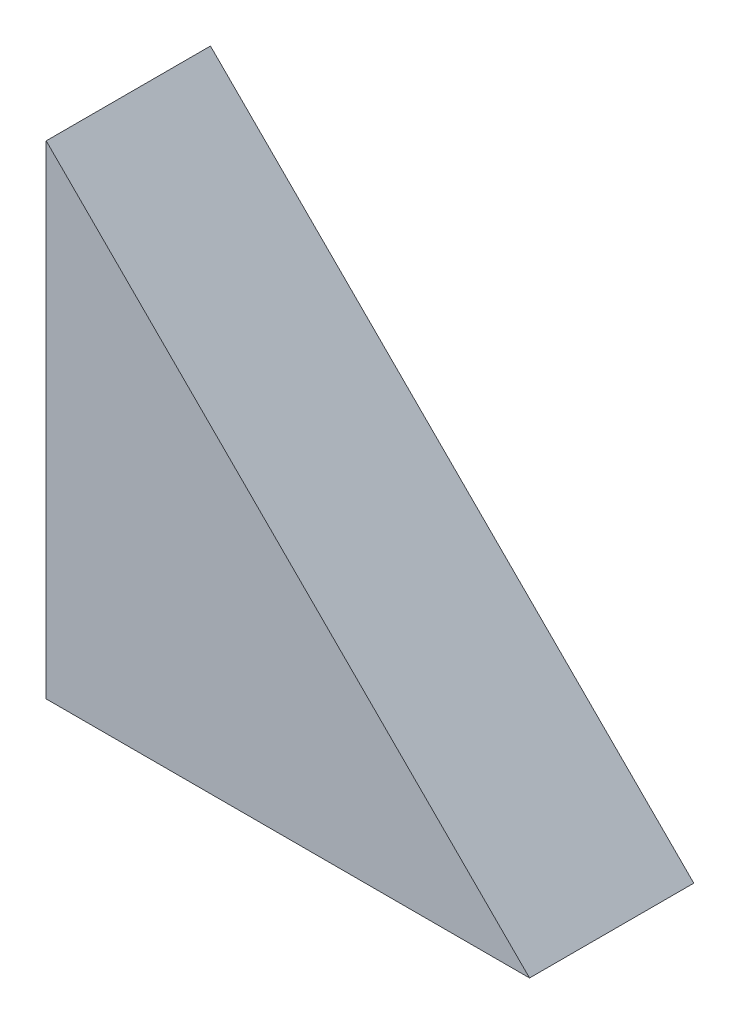
ISO-10303-21;
HEADER;
FILE_DESCRIPTION(('STEP AP214'),'2;1');
FILE_NAME('part.step','',(''),(''),'','','');
FILE_SCHEMA(('AUTOMOTIVE_DESIGN { 1 0 10303 214 1 1 1 1 }'));
ENDSEC;
DATA;
#1=APPLICATION_CONTEXT('core data for automotive mechanical design processes');
#2=APPLICATION_PROTOCOL_DEFINITION('international standard','automotive_design',2000,#1);
#3=PRODUCT_CONTEXT('',#1,'mechanical');
#4=PRODUCT('Part','Part','',(#3));
#5=PRODUCT_RELATED_PRODUCT_CATEGORY('part','',(#4));
#6=PRODUCT_DEFINITION_FORMATION('','',#4);
#7=PRODUCT_DEFINITION_CONTEXT('part definition',#1,'design');
#8=PRODUCT_DEFINITION('design','',#6,#7);
#9=PRODUCT_DEFINITION_SHAPE('','',#8);
#10=(LENGTH_UNIT() NAMED_UNIT(*) SI_UNIT(.MILLI.,.METRE.));
#11=(NAMED_UNIT(*) PLANE_ANGLE_UNIT() SI_UNIT($,.RADIAN.));
#12=(NAMED_UNIT(*) SI_UNIT($,.STERADIAN.) SOLID_ANGLE_UNIT());
#13=UNCERTAINTY_MEASURE_WITH_UNIT(LENGTH_MEASURE(1.E-05),#10,'distance_accuracy_value','');
#14=(GEOMETRIC_REPRESENTATION_CONTEXT(3) GLOBAL_UNCERTAINTY_ASSIGNED_CONTEXT((#13)) GLOBAL_UNIT_ASSIGNED_CONTEXT((#10,
#11,#12)) REPRESENTATION_CONTEXT('',''));
#15=CARTESIAN_POINT('',(0.,0.,0.));
#16=DIRECTION('',(0.,0.,1.));
#17=DIRECTION('',(1.,0.,0.));
#18=AXIS2_PLACEMENT_3D('',#15,#16,#17);
#19=CARTESIAN_POINT('',(0.,103.,35.));
#20=DIRECTION('',(1.,0.,0.));
#21=DIRECTION('',(0.,1.,0.));
#22=AXIS2_PLACEMENT_3D('',#19,#20,#21);
#23=PLANE('',#22);
#24=DIRECTION('',(0.,-1.,0.));
#25=VECTOR('',#24,1.);
#26=CARTESIAN_POINT('',(0.,103.,0.));
#27=LINE('',#26,#25);
#28=CARTESIAN_POINT('',(0.,103.,0.));
#29=VERTEX_POINT('',#28);
#30=CARTESIAN_POINT('',(0.,0.,0.));
#31=VERTEX_POINT('',#30);
#32=EDGE_CURVE('E81',#29,#31,#27,.T.);
#33=ORIENTED_EDGE('',*,*,#32,.T.);
#34=DIRECTION('',(0.,0.,-1.));
#35=VECTOR('',#34,1.);
#36=CARTESIAN_POINT('',(0.,0.,35.));
#37=LINE('',#36,#35);
#38=CARTESIAN_POINT('',(0.,0.,35.));
#39=VERTEX_POINT('',#38);
#40=EDGE_CURVE('E11',#39,#31,#37,.T.);
#41=ORIENTED_EDGE('',*,*,#40,.F.);
#42=DIRECTION('',(0.,-1.,0.));
#43=VECTOR('',#42,1.);
#44=CARTESIAN_POINT('',(0.,103.,35.));
#45=LINE('',#44,#43);
#46=CARTESIAN_POINT('',(0.,103.,35.));
#47=VERTEX_POINT('',#46);
#48=EDGE_CURVE('E74',#47,#39,#45,.T.);
#49=ORIENTED_EDGE('',*,*,#48,.F.);
#50=DIRECTION('',(0.,0.,-1.));
#51=VECTOR('',#50,1.);
#52=CARTESIAN_POINT('',(0.,103.,35.));
#53=LINE('',#52,#51);
#54=EDGE_CURVE('E82',#47,#29,#53,.T.);
#55=ORIENTED_EDGE('',*,*,#54,.T.);
#56=EDGE_LOOP('',(#33,#41,#49,#55));
#57=FACE_BOUND('',#56,.T.);
#58=ADVANCED_FACE('F34',(#57),#23,.F.);
#59=CARTESIAN_POINT('',(0.,0.,35.));
#60=DIRECTION('',(0.,1.,0.));
#61=DIRECTION('',(0.,0.,1.));
#62=AXIS2_PLACEMENT_3D('',#59,#60,#61);
#63=PLANE('',#62);
#64=DIRECTION('',(1.,0.,0.));
#65=VECTOR('',#64,1.);
#66=CARTESIAN_POINT('',(0.,0.,0.));
#67=LINE('',#66,#65);
#68=CARTESIAN_POINT('',(103.,0.,0.));
#69=VERTEX_POINT('',#68);
#70=EDGE_CURVE('E62',#31,#69,#67,.T.);
#71=ORIENTED_EDGE('',*,*,#70,.T.);
#72=DIRECTION('',(0.,0.,-1.));
#73=VECTOR('',#72,1.);
#74=CARTESIAN_POINT('',(103.,0.,35.));
#75=LINE('',#74,#73);
#76=CARTESIAN_POINT('',(103.,0.,35.));
#77=VERTEX_POINT('',#76);
#78=EDGE_CURVE('E42',#77,#69,#75,.T.);
#79=ORIENTED_EDGE('',*,*,#78,.F.);
#80=DIRECTION('',(1.,0.,0.));
#81=VECTOR('',#80,1.);
#82=CARTESIAN_POINT('',(0.,0.,35.));
#83=LINE('',#82,#81);
#84=EDGE_CURVE('E70',#39,#77,#83,.T.);
#85=ORIENTED_EDGE('',*,*,#84,.F.);
#86=ORIENTED_EDGE('',*,*,#40,.T.);
#87=EDGE_LOOP('',(#71,#79,#85,#86));
#88=FACE_BOUND('',#87,.T.);
#89=ADVANCED_FACE('F71',(#88),#63,.F.);
#90=CARTESIAN_POINT('',(103.,0.,35.));
#91=DIRECTION('',(-0.707106781186548,-0.707106781186548,0.));
#92=DIRECTION('',(0.707106781186548,-0.707106781186548,0.));
#93=AXIS2_PLACEMENT_3D('',#90,#91,#92);
#94=PLANE('',#93);
#95=DIRECTION('',(-0.707106781186548,0.707106781186548,0.));
#96=VECTOR('',#95,1.);
#97=CARTESIAN_POINT('',(103.,0.,0.));
#98=LINE('',#97,#96);
#99=EDGE_CURVE('E67',#69,#29,#98,.T.);
#100=ORIENTED_EDGE('',*,*,#99,.T.);
#101=ORIENTED_EDGE('',*,*,#54,.F.);
#102=DIRECTION('',(-0.707106781186548,0.707106781186548,0.));
#103=VECTOR('',#102,1.);
#104=CARTESIAN_POINT('',(103.,0.,35.));
#105=LINE('',#104,#103);
#106=EDGE_CURVE('E50',#77,#47,#105,.T.);
#107=ORIENTED_EDGE('',*,*,#106,.F.);
#108=ORIENTED_EDGE('',*,*,#78,.T.);
#109=EDGE_LOOP('',(#100,#101,#107,#108));
#110=FACE_BOUND('',#109,.T.);
#111=ADVANCED_FACE('F89',(#110),#94,.F.);
#112=CARTESIAN_POINT('',(0.,0.,35.));
#113=DIRECTION('',(0.,0.,1.));
#114=DIRECTION('',(1.,0.,0.));
#115=AXIS2_PLACEMENT_3D('',#112,#113,#114);
#116=PLANE('',#115);
#117=ORIENTED_EDGE('',*,*,#48,.T.);
#118=ORIENTED_EDGE('',*,*,#84,.T.);
#119=ORIENTED_EDGE('',*,*,#106,.T.);
#120=EDGE_LOOP('',(#117,#118,#119));
#121=FACE_BOUND('',#120,.T.);
#122=ADVANCED_FACE('F77',(#121),#116,.T.);
#123=CARTESIAN_POINT('',(0.,0.,0.));
#124=DIRECTION('',(0.,0.,1.));
#125=DIRECTION('',(1.,0.,0.));
#126=AXIS2_PLACEMENT_3D('',#123,#124,#125);
#127=PLANE('',#126);
#128=ORIENTED_EDGE('',*,*,#32,.F.);
#129=ORIENTED_EDGE('',*,*,#99,.F.);
#130=ORIENTED_EDGE('',*,*,#70,.F.);
#131=EDGE_LOOP('',(#128,#129,#130));
#132=FACE_BOUND('',#131,.T.);
#133=ADVANCED_FACE('F90',(#132),#127,.F.);
#134=CLOSED_SHELL('',(#58,#89,#111,#122,#133));
#135=MANIFOLD_SOLID_BREP('B2',#134);
#136=ADVANCED_BREP_SHAPE_REPRESENTATION('',(#18,#135),#14);
#137=SHAPE_DEFINITION_REPRESENTATION(#9,#136);
ENDSEC;
END-ISO-10303-21;
